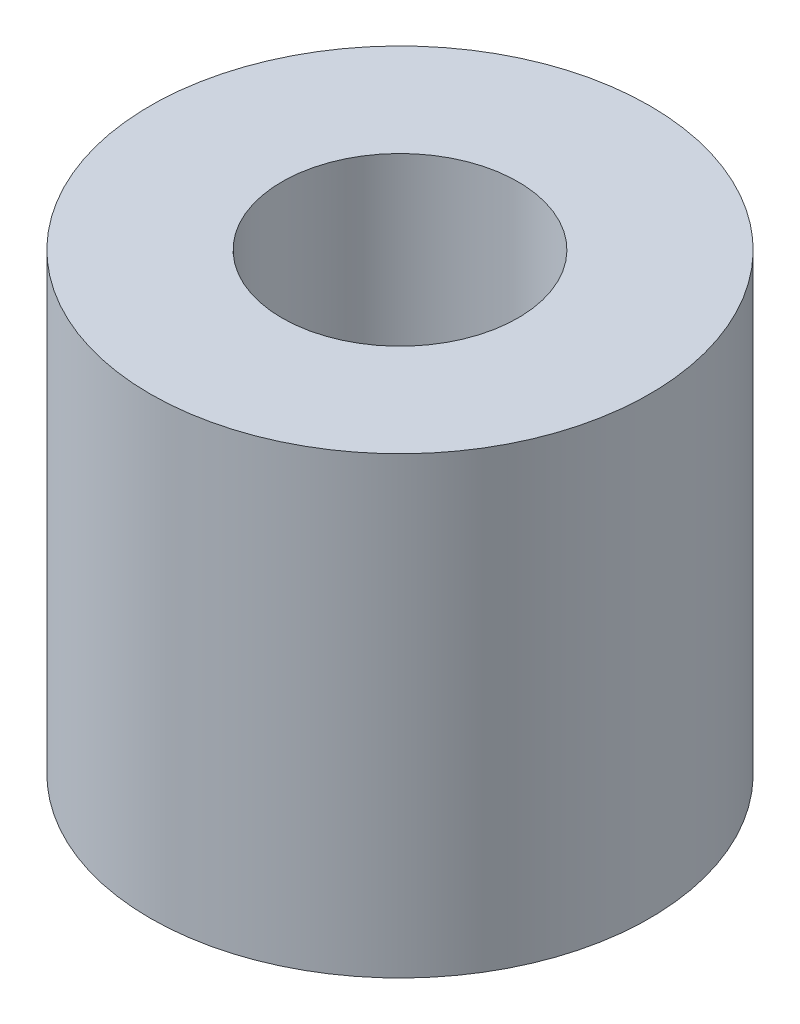
ISO-10303-21;
HEADER;
FILE_DESCRIPTION(('STEP AP214'),'2;1');
FILE_NAME('part.step','',(''),(''),'','','');
FILE_SCHEMA(('AUTOMOTIVE_DESIGN { 1 0 10303 214 1 1 1 1 }'));
ENDSEC;
DATA;
#1=APPLICATION_CONTEXT('core data for automotive mechanical design processes');
#2=APPLICATION_PROTOCOL_DEFINITION('international standard','automotive_design',2000,#1);
#3=PRODUCT_CONTEXT('',#1,'mechanical');
#4=PRODUCT('Part','Part','',(#3));
#5=PRODUCT_RELATED_PRODUCT_CATEGORY('part','',(#4));
#6=PRODUCT_DEFINITION_FORMATION('','',#4);
#7=PRODUCT_DEFINITION_CONTEXT('part definition',#1,'design');
#8=PRODUCT_DEFINITION('design','',#6,#7);
#9=PRODUCT_DEFINITION_SHAPE('','',#8);
#10=(LENGTH_UNIT() NAMED_UNIT(*) SI_UNIT(.MILLI.,.METRE.));
#11=(NAMED_UNIT(*) PLANE_ANGLE_UNIT() SI_UNIT($,.RADIAN.));
#12=(NAMED_UNIT(*) SI_UNIT($,.STERADIAN.) SOLID_ANGLE_UNIT());
#13=UNCERTAINTY_MEASURE_WITH_UNIT(LENGTH_MEASURE(1.E-05),#10,'distance_accuracy_value','');
#14=(GEOMETRIC_REPRESENTATION_CONTEXT(3) GLOBAL_UNCERTAINTY_ASSIGNED_CONTEXT((#13)) GLOBAL_UNIT_ASSIGNED_CONTEXT((#10,
#11,#12)) REPRESENTATION_CONTEXT('',''));
#15=CARTESIAN_POINT('',(0.,0.,0.));
#16=DIRECTION('',(0.,0.,1.));
#17=DIRECTION('',(1.,0.,0.));
#18=AXIS2_PLACEMENT_3D('',#15,#16,#17);
#19=CARTESIAN_POINT('',(0.,10.,0.));
#20=DIRECTION('',(0.,1.,0.));
#21=DIRECTION('',(0.,0.,1.));
#22=AXIS2_PLACEMENT_3D('',#19,#20,#21);
#23=PLANE('',#22);
#24=CARTESIAN_POINT('',(0.,10.,0.));
#25=DIRECTION('',(0.,1.,0.));
#26=DIRECTION('',(0.,0.,1.));
#27=AXIS2_PLACEMENT_3D('',#24,#25,#26);
#28=CIRCLE('',#27,5.5);
#29=CARTESIAN_POINT('',(0.,10.,5.5));
#30=VERTEX_POINT('',#29);
#31=EDGE_CURVE('E10',#30,#30,#28,.T.);
#32=ORIENTED_EDGE('',*,*,#31,.T.);
#33=EDGE_LOOP('',(#32));
#34=FACE_BOUND('',#33,.T.);
#35=CARTESIAN_POINT('',(0.,10.,0.));
#36=DIRECTION('',(0.,1.,0.));
#37=DIRECTION('',(0.,0.,1.));
#38=AXIS2_PLACEMENT_3D('',#35,#36,#37);
#39=CIRCLE('',#38,2.6);
#40=CARTESIAN_POINT('',(0.,10.,2.6));
#41=VERTEX_POINT('',#40);
#42=EDGE_CURVE('E50',#41,#41,#39,.T.);
#43=ORIENTED_EDGE('',*,*,#42,.F.);
#44=EDGE_LOOP('',(#43));
#45=FACE_BOUND('',#44,.T.);
#46=ADVANCED_FACE('F37',(#34,#45),#23,.T.);
#47=CARTESIAN_POINT('',(0.,0.,0.));
#48=DIRECTION('',(0.,1.,0.));
#49=DIRECTION('',(0.,0.,1.));
#50=AXIS2_PLACEMENT_3D('',#47,#48,#49);
#51=PLANE('',#50);
#52=CARTESIAN_POINT('',(0.,0.,0.));
#53=DIRECTION('',(0.,1.,0.));
#54=DIRECTION('',(0.,0.,1.));
#55=AXIS2_PLACEMENT_3D('',#52,#53,#54);
#56=CIRCLE('',#55,5.5);
#57=CARTESIAN_POINT('',(0.,0.,5.5));
#58=VERTEX_POINT('',#57);
#59=EDGE_CURVE('E41',#58,#58,#56,.T.);
#60=ORIENTED_EDGE('',*,*,#59,.F.);
#61=EDGE_LOOP('',(#60));
#62=FACE_BOUND('',#61,.T.);
#63=CARTESIAN_POINT('',(0.,0.,0.));
#64=DIRECTION('',(0.,1.,0.));
#65=DIRECTION('',(0.,0.,1.));
#66=AXIS2_PLACEMENT_3D('',#63,#64,#65);
#67=CIRCLE('',#66,2.6);
#68=CARTESIAN_POINT('',(0.,0.,2.6));
#69=VERTEX_POINT('',#68);
#70=EDGE_CURVE('E52',#69,#69,#67,.T.);
#71=ORIENTED_EDGE('',*,*,#70,.T.);
#72=EDGE_LOOP('',(#71));
#73=FACE_BOUND('',#72,.T.);
#74=ADVANCED_FACE('F64',(#62,#73),#51,.F.);
#75=CARTESIAN_POINT('',(0.,10.,0.));
#76=DIRECTION('',(0.,-1.,0.));
#77=DIRECTION('',(0.,0.,-1.));
#78=AXIS2_PLACEMENT_3D('',#75,#76,#77);
#79=CYLINDRICAL_SURFACE('',#78,5.5);
#80=ORIENTED_EDGE('',*,*,#31,.F.);
#81=EDGE_LOOP('',(#80));
#82=FACE_BOUND('',#81,.T.);
#83=ORIENTED_EDGE('',*,*,#59,.T.);
#84=EDGE_LOOP('',(#83));
#85=FACE_BOUND('',#84,.T.);
#86=ADVANCED_FACE('F39',(#82,#85),#79,.T.);
#87=CARTESIAN_POINT('',(0.,10.,0.));
#88=DIRECTION('',(0.,-1.,0.));
#89=DIRECTION('',(0.,0.,-1.));
#90=AXIS2_PLACEMENT_3D('',#87,#88,#89);
#91=CYLINDRICAL_SURFACE('',#90,2.6);
#92=ORIENTED_EDGE('',*,*,#42,.T.);
#93=EDGE_LOOP('',(#92));
#94=FACE_BOUND('',#93,.T.);
#95=ORIENTED_EDGE('',*,*,#70,.F.);
#96=EDGE_LOOP('',(#95));
#97=FACE_BOUND('',#96,.T.);
#98=ADVANCED_FACE('F60',(#94,#97),#91,.F.);
#99=CLOSED_SHELL('',(#46,#74,#86,#98));
#100=MANIFOLD_SOLID_BREP('B2',#99);
#101=ADVANCED_BREP_SHAPE_REPRESENTATION('',(#18,#100),#14);
#102=SHAPE_DEFINITION_REPRESENTATION(#9,#101);
ENDSEC;
END-ISO-10303-21;
